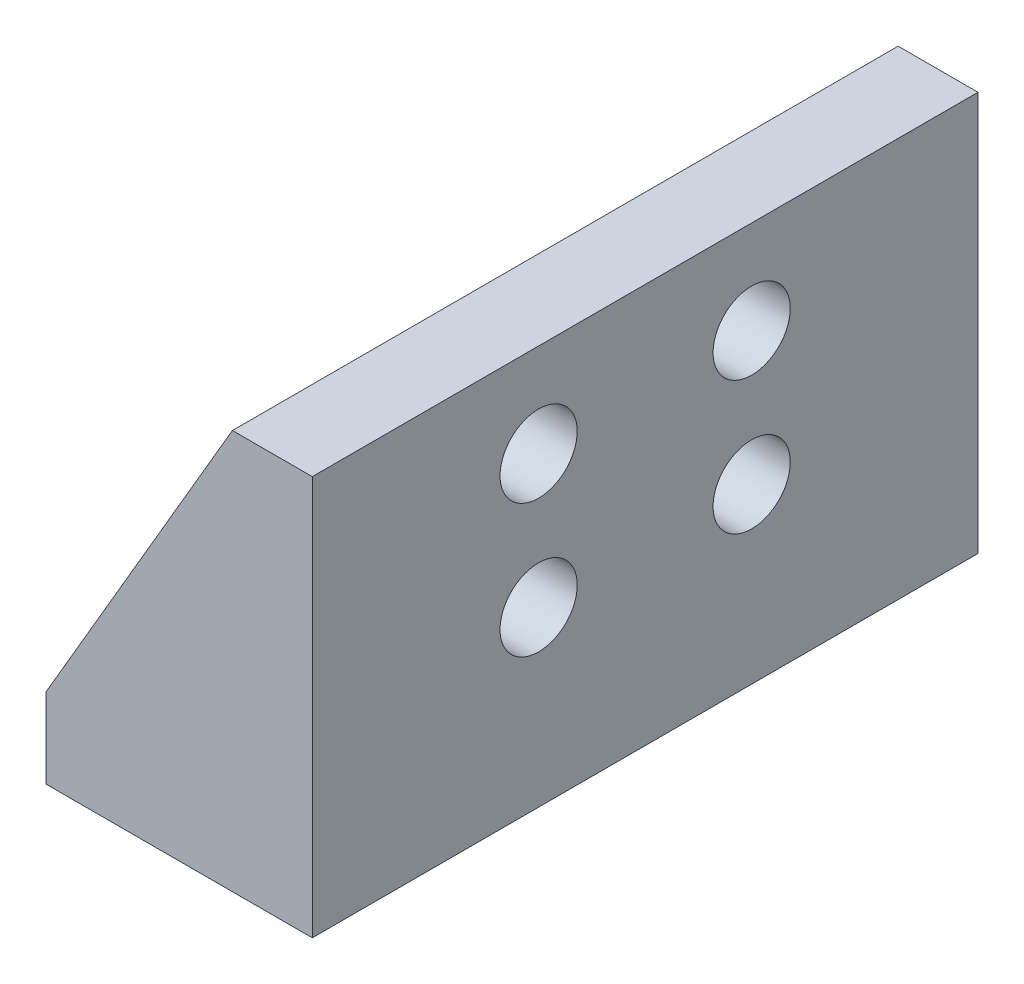
ISO-10303-21;
HEADER;
FILE_DESCRIPTION(('STEP AP214'),'2;1');
FILE_NAME('part.step','',(''),(''),'','','');
FILE_SCHEMA(('AUTOMOTIVE_DESIGN { 1 0 10303 214 1 1 1 1 }'));
ENDSEC;
DATA;
#1=APPLICATION_CONTEXT('core data for automotive mechanical design processes');
#2=APPLICATION_PROTOCOL_DEFINITION('international standard','automotive_design',2000,#1);
#3=PRODUCT_CONTEXT('',#1,'mechanical');
#4=PRODUCT('Part','Part','',(#3));
#5=PRODUCT_RELATED_PRODUCT_CATEGORY('part','',(#4));
#6=PRODUCT_DEFINITION_FORMATION('','',#4);
#7=PRODUCT_DEFINITION_CONTEXT('part definition',#1,'design');
#8=PRODUCT_DEFINITION('design','',#6,#7);
#9=PRODUCT_DEFINITION_SHAPE('','',#8);
#10=(LENGTH_UNIT() NAMED_UNIT(*) SI_UNIT(.MILLI.,.METRE.));
#11=(NAMED_UNIT(*) PLANE_ANGLE_UNIT() SI_UNIT($,.RADIAN.));
#12=(NAMED_UNIT(*) SI_UNIT($,.STERADIAN.) SOLID_ANGLE_UNIT());
#13=UNCERTAINTY_MEASURE_WITH_UNIT(LENGTH_MEASURE(1.E-05),#10,'distance_accuracy_value','');
#14=(GEOMETRIC_REPRESENTATION_CONTEXT(3) GLOBAL_UNCERTAINTY_ASSIGNED_CONTEXT((#13)) GLOBAL_UNIT_ASSIGNED_CONTEXT((#10,
#11,#12)) REPRESENTATION_CONTEXT('',''));
#15=CARTESIAN_POINT('',(0.,0.,0.));
#16=DIRECTION('',(0.,0.,1.));
#17=DIRECTION('',(1.,0.,0.));
#18=AXIS2_PLACEMENT_3D('',#15,#16,#17);
#19=CARTESIAN_POINT('',(3.5,-297.,-8.75));
#20=DIRECTION('',(0.,1.,0.));
#21=DIRECTION('',(0.,0.,1.));
#22=AXIS2_PLACEMENT_3D('',#19,#20,#21);
#23=CYLINDRICAL_SURFACE('',#22,1.45);
#24=CARTESIAN_POINT('',(3.5,0.,-8.75));
#25=DIRECTION('',(0.,-1.,0.));
#26=DIRECTION('',(0.,0.,-1.));
#27=AXIS2_PLACEMENT_3D('',#24,#25,#26);
#28=CIRCLE('',#27,1.45);
#29=CARTESIAN_POINT('',(3.5,0.,-10.2));
#30=VERTEX_POINT('',#29);
#31=EDGE_CURVE('E193',#30,#30,#28,.T.);
#32=ORIENTED_EDGE('',*,*,#31,.T.);
#33=EDGE_LOOP('',(#32));
#34=FACE_BOUND('',#33,.T.);
#35=CARTESIAN_POINT('',(3.5,1.,-8.75));
#36=DIRECTION('',(0.,1.,0.));
#37=DIRECTION('',(0.,0.,1.));
#38=AXIS2_PLACEMENT_3D('',#35,#36,#37);
#39=CIRCLE('',#38,1.45);
#40=CARTESIAN_POINT('',(3.5,1.,-7.3));
#41=VERTEX_POINT('',#40);
#42=EDGE_CURVE('E45',#41,#41,#39,.F.);
#43=ORIENTED_EDGE('',*,*,#42,.F.);
#44=EDGE_LOOP('',(#43));
#45=FACE_BOUND('',#44,.T.);
#46=ADVANCED_FACE('F41',(#34,#45),#23,.F.);
#47=CARTESIAN_POINT('',(3.5,-297.,-16.25));
#48=DIRECTION('',(0.,1.,0.));
#49=DIRECTION('',(0.,0.,1.));
#50=AXIS2_PLACEMENT_3D('',#47,#48,#49);
#51=CYLINDRICAL_SURFACE('',#50,1.45);
#52=CARTESIAN_POINT('',(3.5,0.,-16.25));
#53=DIRECTION('',(0.,-1.,0.));
#54=DIRECTION('',(0.,0.,-1.));
#55=AXIS2_PLACEMENT_3D('',#52,#53,#54);
#56=CIRCLE('',#55,1.45);
#57=CARTESIAN_POINT('',(3.5,0.,-17.7));
#58=VERTEX_POINT('',#57);
#59=EDGE_CURVE('E196',#58,#58,#56,.T.);
#60=ORIENTED_EDGE('',*,*,#59,.T.);
#61=EDGE_LOOP('',(#60));
#62=FACE_BOUND('',#61,.T.);
#63=CARTESIAN_POINT('',(3.5,1.,-16.25));
#64=DIRECTION('',(0.,1.,0.));
#65=DIRECTION('',(0.,0.,1.));
#66=AXIS2_PLACEMENT_3D('',#63,#64,#65);
#67=CIRCLE('',#66,1.45);
#68=CARTESIAN_POINT('',(3.5,1.,-14.8));
#69=VERTEX_POINT('',#68);
#70=EDGE_CURVE('E199',#69,#69,#67,.F.);
#71=ORIENTED_EDGE('',*,*,#70,.F.);
#72=EDGE_LOOP('',(#71));
#73=FACE_BOUND('',#72,.T.);
#74=ADVANCED_FACE('F243',(#62,#73),#51,.F.);
#75=CARTESIAN_POINT('',(0.,3.,-25.));
#76=DIRECTION('',(0.,1.,0.));
#77=DIRECTION('',(0.,0.,1.));
#78=AXIS2_PLACEMENT_3D('',#75,#76,#77);
#79=PLANE('',#78);
#80=CARTESIAN_POINT('',(3.5,3.,-16.25));
#81=DIRECTION('',(0.,1.,0.));
#82=DIRECTION('',(0.,0.,1.));
#83=AXIS2_PLACEMENT_3D('',#80,#81,#82);
#84=CIRCLE('',#83,2.6);
#85=CARTESIAN_POINT('',(3.5,3.,-13.65));
#86=VERTEX_POINT('',#85);
#87=EDGE_CURVE('E206',#86,#86,#84,.T.);
#88=ORIENTED_EDGE('',*,*,#87,.F.);
#89=EDGE_LOOP('',(#88));
#90=FACE_BOUND('',#89,.T.);
#91=CARTESIAN_POINT('',(3.5,3.,-8.75));
#92=DIRECTION('',(0.,1.,0.));
#93=DIRECTION('',(0.,0.,1.));
#94=AXIS2_PLACEMENT_3D('',#91,#92,#93);
#95=CIRCLE('',#94,2.6);
#96=CARTESIAN_POINT('',(3.5,3.,-6.15));
#97=VERTEX_POINT('',#96);
#98=EDGE_CURVE('E216',#97,#97,#95,.T.);
#99=ORIENTED_EDGE('',*,*,#98,.F.);
#100=EDGE_LOOP('',(#99));
#101=FACE_BOUND('',#100,.T.);
#102=DIRECTION('',(0.,0.,1.));
#103=VECTOR('',#102,1.);
#104=CARTESIAN_POINT('',(7.,3.,-25.));
#105=LINE('',#104,#103);
#106=CARTESIAN_POINT('',(7.,3.,-20.));
#107=VERTEX_POINT('',#106);
#108=CARTESIAN_POINT('',(7.,3.,-5.));
#109=VERTEX_POINT('',#108);
#110=EDGE_CURVE('E175',#107,#109,#105,.T.);
#111=ORIENTED_EDGE('',*,*,#110,.F.);
#112=DIRECTION('',(-1.,0.,0.));
#113=VECTOR('',#112,1.);
#114=CARTESIAN_POINT('',(7.,3.,-20.));
#115=LINE('',#114,#113);
#116=CARTESIAN_POINT('',(0.,3.,-20.));
#117=VERTEX_POINT('',#116);
#118=EDGE_CURVE('E58',#107,#117,#115,.T.);
#119=ORIENTED_EDGE('',*,*,#118,.T.);
#120=DIRECTION('',(0.,0.,1.));
#121=VECTOR('',#120,1.);
#122=CARTESIAN_POINT('',(0.,3.,-25.));
#123=LINE('',#122,#121);
#124=CARTESIAN_POINT('',(0.,3.,-5.));
#125=VERTEX_POINT('',#124);
#126=EDGE_CURVE('E50',#117,#125,#123,.T.);
#127=ORIENTED_EDGE('',*,*,#126,.T.);
#128=DIRECTION('',(1.,0.,0.));
#129=VECTOR('',#128,1.);
#130=CARTESIAN_POINT('',(7.,3.,-5.));
#131=LINE('',#130,#129);
#132=EDGE_CURVE('E147',#125,#109,#131,.T.);
#133=ORIENTED_EDGE('',*,*,#132,.T.);
#134=EDGE_LOOP('',(#111,#119,#127,#133));
#135=FACE_BOUND('',#134,.T.);
#136=ADVANCED_FACE('F250',(#90,#101,#135),#79,.T.);
#137=CARTESIAN_POINT('',(7.,3.,-25.));
#138=DIRECTION('',(-1.,0.,0.));
#139=DIRECTION('',(0.,0.,1.));
#140=AXIS2_PLACEMENT_3D('',#137,#138,#139);
#141=PLANE('',#140);
#142=CARTESIAN_POINT('',(7.,6.5,-16.5));
#143=DIRECTION('',(-1.,0.,0.));
#144=DIRECTION('',(0.,0.,1.));
#145=AXIS2_PLACEMENT_3D('',#142,#143,#144);
#146=CIRCLE('',#145,1.45);
#147=CARTESIAN_POINT('',(7.,6.5,-15.05));
#148=VERTEX_POINT('',#147);
#149=EDGE_CURVE('E222',#148,#148,#146,.T.);
#150=ORIENTED_EDGE('',*,*,#149,.F.);
#151=EDGE_LOOP('',(#150));
#152=FACE_BOUND('',#151,.T.);
#153=CARTESIAN_POINT('',(7.,11.5,-8.5));
#154=DIRECTION('',(-1.,0.,0.));
#155=DIRECTION('',(0.,0.,1.));
#156=AXIS2_PLACEMENT_3D('',#153,#154,#155);
#157=CIRCLE('',#156,1.45);
#158=CARTESIAN_POINT('',(7.,11.5,-7.05));
#159=VERTEX_POINT('',#158);
#160=EDGE_CURVE('E221',#159,#159,#157,.T.);
#161=ORIENTED_EDGE('',*,*,#160,.F.);
#162=EDGE_LOOP('',(#161));
#163=FACE_BOUND('',#162,.T.);
#164=CARTESIAN_POINT('',(7.,6.5,-8.5));
#165=DIRECTION('',(-1.,0.,0.));
#166=DIRECTION('',(0.,0.,1.));
#167=AXIS2_PLACEMENT_3D('',#164,#165,#166);
#168=CIRCLE('',#167,1.45);
#169=CARTESIAN_POINT('',(7.,6.5,-7.05));
#170=VERTEX_POINT('',#169);
#171=EDGE_CURVE('E198',#170,#170,#168,.T.);
#172=ORIENTED_EDGE('',*,*,#171,.F.);
#173=EDGE_LOOP('',(#172));
#174=FACE_BOUND('',#173,.T.);
#175=CARTESIAN_POINT('',(7.,11.5,-16.5));
#176=DIRECTION('',(-1.,0.,0.));
#177=DIRECTION('',(0.,0.,1.));
#178=AXIS2_PLACEMENT_3D('',#175,#176,#177);
#179=CIRCLE('',#178,1.45);
#180=CARTESIAN_POINT('',(7.,11.5,-15.05));
#181=VERTEX_POINT('',#180);
#182=EDGE_CURVE('E188',#181,#181,#179,.T.);
#183=ORIENTED_EDGE('',*,*,#182,.F.);
#184=EDGE_LOOP('',(#183));
#185=FACE_BOUND('',#184,.T.);
#186=DIRECTION('',(0.,0.,1.));
#187=VECTOR('',#186,1.);
#188=CARTESIAN_POINT('',(7.,15.,-25.));
#189=LINE('',#188,#187);
#190=CARTESIAN_POINT('',(7.,15.,-20.));
#191=VERTEX_POINT('',#190);
#192=CARTESIAN_POINT('',(7.,15.,-5.));
#193=VERTEX_POINT('',#192);
#194=EDGE_CURVE('E178',#191,#193,#189,.T.);
#195=ORIENTED_EDGE('',*,*,#194,.F.);
#196=DIRECTION('',(0.,-1.,0.));
#197=VECTOR('',#196,1.);
#198=CARTESIAN_POINT('',(7.,15.,-20.));
#199=LINE('',#198,#197);
#200=EDGE_CURVE('E66',#191,#107,#199,.T.);
#201=ORIENTED_EDGE('',*,*,#200,.T.);
#202=ORIENTED_EDGE('',*,*,#110,.T.);
#203=DIRECTION('',(0.,1.,0.));
#204=VECTOR('',#203,1.);
#205=CARTESIAN_POINT('',(7.,15.,-5.));
#206=LINE('',#205,#204);
#207=EDGE_CURVE('E140',#109,#193,#206,.T.);
#208=ORIENTED_EDGE('',*,*,#207,.T.);
#209=EDGE_LOOP('',(#195,#201,#202,#208));
#210=FACE_BOUND('',#209,.T.);
#211=ADVANCED_FACE('F273',(#152,#163,#174,#185,#210),#141,.T.);
#212=CARTESIAN_POINT('',(0.,0.,-25.));
#213=DIRECTION('',(-1.,0.,0.));
#214=DIRECTION('',(0.,0.,1.));
#215=AXIS2_PLACEMENT_3D('',#212,#213,#214);
#216=PLANE('',#215);
#217=DIRECTION('',(0.,-1.,0.));
#218=VECTOR('',#217,1.);
#219=CARTESIAN_POINT('',(0.,0.,0.));
#220=LINE('',#219,#218);
#221=CARTESIAN_POINT('',(0.,3.,0.));
#222=VERTEX_POINT('',#221);
#223=CARTESIAN_POINT('',(0.,0.,0.));
#224=VERTEX_POINT('',#223);
#225=EDGE_CURVE('E155',#222,#224,#220,.T.);
#226=ORIENTED_EDGE('',*,*,#225,.F.);
#227=DIRECTION('',(0.,0.,1.));
#228=VECTOR('',#227,1.);
#229=CARTESIAN_POINT('',(0.,3.,-5.));
#230=LINE('',#229,#228);
#231=EDGE_CURVE('E152',#125,#222,#230,.T.);
#232=ORIENTED_EDGE('',*,*,#231,.F.);
#233=ORIENTED_EDGE('',*,*,#126,.F.);
#234=CARTESIAN_POINT('',(0.,3.,-25.));
#235=VERTEX_POINT('',#234);
#236=EDGE_CURVE('E11',#235,#117,#123,.T.);
#237=ORIENTED_EDGE('',*,*,#236,.F.);
#238=DIRECTION('',(0.,-1.,0.));
#239=VECTOR('',#238,1.);
#240=CARTESIAN_POINT('',(0.,0.,-25.));
#241=LINE('',#240,#239);
#242=CARTESIAN_POINT('',(0.,0.,-25.));
#243=VERTEX_POINT('',#242);
#244=EDGE_CURVE('E109',#235,#243,#241,.T.);
#245=ORIENTED_EDGE('',*,*,#244,.T.);
#246=DIRECTION('',(0.,0.,1.));
#247=VECTOR('',#246,1.);
#248=CARTESIAN_POINT('',(0.,0.,-25.));
#249=LINE('',#248,#247);
#250=EDGE_CURVE('E164',#243,#224,#249,.T.);
#251=ORIENTED_EDGE('',*,*,#250,.T.);
#252=EDGE_LOOP('',(#226,#232,#233,#237,#245,#251));
#253=FACE_BOUND('',#252,.T.);
#254=ADVANCED_FACE('F43',(#253),#216,.T.);
#255=CARTESIAN_POINT('',(7.,15.,-25.));
#256=DIRECTION('',(0.,1.,0.));
#257=DIRECTION('',(0.,0.,1.));
#258=AXIS2_PLACEMENT_3D('',#255,#256,#257);
#259=PLANE('',#258);
#260=DIRECTION('',(-1.,0.,0.));
#261=VECTOR('',#260,1.);
#262=CARTESIAN_POINT('',(7.,15.,0.));
#263=LINE('',#262,#261);
#264=CARTESIAN_POINT('',(10.,15.,0.));
#265=VERTEX_POINT('',#264);
#266=CARTESIAN_POINT('',(7.,15.,0.));
#267=VERTEX_POINT('',#266);
#268=EDGE_CURVE('E119',#265,#267,#263,.T.);
#269=ORIENTED_EDGE('',*,*,#268,.F.);
#270=DIRECTION('',(0.,0.,1.));
#271=VECTOR('',#270,1.);
#272=CARTESIAN_POINT('',(10.,15.,-25.));
#273=LINE('',#272,#271);
#274=CARTESIAN_POINT('',(10.,15.,-25.));
#275=VERTEX_POINT('',#274);
#276=EDGE_CURVE('E179',#275,#265,#273,.T.);
#277=ORIENTED_EDGE('',*,*,#276,.F.);
#278=DIRECTION('',(-1.,0.,0.));
#279=VECTOR('',#278,1.);
#280=CARTESIAN_POINT('',(7.,15.,-25.));
#281=LINE('',#280,#279);
#282=CARTESIAN_POINT('',(7.,15.,-25.));
#283=VERTEX_POINT('',#282);
#284=EDGE_CURVE('E162',#275,#283,#281,.T.);
#285=ORIENTED_EDGE('',*,*,#284,.T.);
#286=EDGE_CURVE('E129',#283,#191,#189,.T.);
#287=ORIENTED_EDGE('',*,*,#286,.T.);
#288=ORIENTED_EDGE('',*,*,#194,.T.);
#289=DIRECTION('',(0.,0.,1.));
#290=VECTOR('',#289,1.);
#291=CARTESIAN_POINT('',(7.,15.,-5.));
#292=LINE('',#291,#290);
#293=EDGE_CURVE('E150',#193,#267,#292,.T.);
#294=ORIENTED_EDGE('',*,*,#293,.T.);
#295=EDGE_LOOP('',(#269,#277,#285,#287,#288,#294));
#296=FACE_BOUND('',#295,.T.);
#297=ADVANCED_FACE('F285',(#296),#259,.T.);
#298=CARTESIAN_POINT('',(10.,0.,-25.));
#299=DIRECTION('',(1.,0.,0.));
#300=DIRECTION('',(0.,0.,-1.));
#301=AXIS2_PLACEMENT_3D('',#298,#299,#300);
#302=PLANE('',#301);
#303=CARTESIAN_POINT('',(10.,6.5,-16.5));
#304=DIRECTION('',(1.,0.,0.));
#305=DIRECTION('',(0.,0.,-1.));
#306=AXIS2_PLACEMENT_3D('',#303,#304,#305);
#307=CIRCLE('',#306,1.45);
#308=CARTESIAN_POINT('',(10.,6.5,-17.95));
#309=VERTEX_POINT('',#308);
#310=EDGE_CURVE('E130',#309,#309,#307,.T.);
#311=ORIENTED_EDGE('',*,*,#310,.F.);
#312=EDGE_LOOP('',(#311));
#313=FACE_BOUND('',#312,.T.);
#314=CARTESIAN_POINT('',(10.,11.5,-8.5));
#315=DIRECTION('',(1.,0.,0.));
#316=DIRECTION('',(0.,0.,-1.));
#317=AXIS2_PLACEMENT_3D('',#314,#315,#316);
#318=CIRCLE('',#317,1.45);
#319=CARTESIAN_POINT('',(10.,11.5,-9.95));
#320=VERTEX_POINT('',#319);
#321=EDGE_CURVE('E134',#320,#320,#318,.T.);
#322=ORIENTED_EDGE('',*,*,#321,.F.);
#323=EDGE_LOOP('',(#322));
#324=FACE_BOUND('',#323,.T.);
#325=CARTESIAN_POINT('',(10.,6.5,-8.5));
#326=DIRECTION('',(1.,0.,0.));
#327=DIRECTION('',(0.,0.,-1.));
#328=AXIS2_PLACEMENT_3D('',#325,#326,#327);
#329=CIRCLE('',#328,1.45);
#330=CARTESIAN_POINT('',(10.,6.5,-9.95));
#331=VERTEX_POINT('',#330);
#332=EDGE_CURVE('E187',#331,#331,#329,.T.);
#333=ORIENTED_EDGE('',*,*,#332,.F.);
#334=EDGE_LOOP('',(#333));
#335=FACE_BOUND('',#334,.T.);
#336=CARTESIAN_POINT('',(10.,11.5,-16.5));
#337=DIRECTION('',(1.,0.,0.));
#338=DIRECTION('',(0.,0.,-1.));
#339=AXIS2_PLACEMENT_3D('',#336,#337,#338);
#340=CIRCLE('',#339,1.45);
#341=CARTESIAN_POINT('',(10.,11.5,-17.95));
#342=VERTEX_POINT('',#341);
#343=EDGE_CURVE('E184',#342,#342,#340,.T.);
#344=ORIENTED_EDGE('',*,*,#343,.F.);
#345=EDGE_LOOP('',(#344));
#346=FACE_BOUND('',#345,.T.);
#347=DIRECTION('',(0.,1.,0.));
#348=VECTOR('',#347,1.);
#349=CARTESIAN_POINT('',(10.,0.,0.));
#350=LINE('',#349,#348);
#351=CARTESIAN_POINT('',(10.,0.,0.));
#352=VERTEX_POINT('',#351);
#353=EDGE_CURVE('E170',#352,#265,#350,.T.);
#354=ORIENTED_EDGE('',*,*,#353,.F.);
#355=DIRECTION('',(0.,0.,1.));
#356=VECTOR('',#355,1.);
#357=CARTESIAN_POINT('',(10.,0.,-25.));
#358=LINE('',#357,#356);
#359=CARTESIAN_POINT('',(10.,0.,-25.));
#360=VERTEX_POINT('',#359);
#361=EDGE_CURVE('E181',#360,#352,#358,.T.);
#362=ORIENTED_EDGE('',*,*,#361,.F.);
#363=DIRECTION('',(0.,1.,0.));
#364=VECTOR('',#363,1.);
#365=CARTESIAN_POINT('',(10.,0.,-25.));
#366=LINE('',#365,#364);
#367=EDGE_CURVE('E159',#360,#275,#366,.T.);
#368=ORIENTED_EDGE('',*,*,#367,.T.);
#369=ORIENTED_EDGE('',*,*,#276,.T.);
#370=EDGE_LOOP('',(#354,#362,#368,#369));
#371=FACE_BOUND('',#370,.T.);
#372=ADVANCED_FACE('F288',(#313,#324,#335,#346,#371),#302,.T.);
#373=CARTESIAN_POINT('',(0.,0.,-25.));
#374=DIRECTION('',(0.,-1.,0.));
#375=DIRECTION('',(0.,0.,-1.));
#376=AXIS2_PLACEMENT_3D('',#373,#374,#375);
#377=PLANE('',#376);
#378=ORIENTED_EDGE('',*,*,#59,.F.);
#379=EDGE_LOOP('',(#378));
#380=FACE_BOUND('',#379,.T.);
#381=ORIENTED_EDGE('',*,*,#31,.F.);
#382=EDGE_LOOP('',(#381));
#383=FACE_BOUND('',#382,.T.);
#384=DIRECTION('',(1.,0.,0.));
#385=VECTOR('',#384,1.);
#386=CARTESIAN_POINT('',(0.,0.,0.));
#387=LINE('',#386,#385);
#388=EDGE_CURVE('E167',#224,#352,#387,.T.);
#389=ORIENTED_EDGE('',*,*,#388,.F.);
#390=ORIENTED_EDGE('',*,*,#250,.F.);
#391=DIRECTION('',(1.,0.,0.));
#392=VECTOR('',#391,1.);
#393=CARTESIAN_POINT('',(0.,0.,-25.));
#394=LINE('',#393,#392);
#395=EDGE_CURVE('E117',#243,#360,#394,.T.);
#396=ORIENTED_EDGE('',*,*,#395,.T.);
#397=ORIENTED_EDGE('',*,*,#361,.T.);
#398=EDGE_LOOP('',(#389,#390,#396,#397));
#399=FACE_BOUND('',#398,.T.);
#400=ADVANCED_FACE('F291',(#380,#383,#399),#377,.T.);
#401=CARTESIAN_POINT('',(0.,0.,-25.));
#402=DIRECTION('',(0.,0.,-1.));
#403=DIRECTION('',(-1.,0.,0.));
#404=AXIS2_PLACEMENT_3D('',#401,#402,#403);
#405=PLANE('',#404);
#406=ORIENTED_EDGE('',*,*,#244,.F.);
#407=DIRECTION('',(0.503871025524086,0.863778900898433,0.));
#408=VECTOR('',#407,1.);
#409=CARTESIAN_POINT('',(7.,15.,-25.));
#410=LINE('',#409,#408);
#411=EDGE_CURVE('E114',#235,#283,#410,.T.);
#412=ORIENTED_EDGE('',*,*,#411,.T.);
#413=ORIENTED_EDGE('',*,*,#284,.F.);
#414=ORIENTED_EDGE('',*,*,#367,.F.);
#415=ORIENTED_EDGE('',*,*,#395,.F.);
#416=EDGE_LOOP('',(#406,#412,#413,#414,#415));
#417=FACE_BOUND('',#416,.T.);
#418=ADVANCED_FACE('F111',(#417),#405,.T.);
#419=CARTESIAN_POINT('',(0.,0.,0.));
#420=DIRECTION('',(0.,0.,-1.));
#421=DIRECTION('',(-1.,0.,0.));
#422=AXIS2_PLACEMENT_3D('',#419,#420,#421);
#423=PLANE('',#422);
#424=ORIENTED_EDGE('',*,*,#225,.T.);
#425=ORIENTED_EDGE('',*,*,#388,.T.);
#426=ORIENTED_EDGE('',*,*,#353,.T.);
#427=ORIENTED_EDGE('',*,*,#268,.T.);
#428=DIRECTION('',(-0.503871025524086,-0.863778900898433,0.));
#429=VECTOR('',#428,1.);
#430=CARTESIAN_POINT('',(7.,15.,0.));
#431=LINE('',#430,#429);
#432=EDGE_CURVE('E144',#267,#222,#431,.T.);
#433=ORIENTED_EDGE('',*,*,#432,.T.);
#434=EDGE_LOOP('',(#424,#425,#426,#427,#433));
#435=FACE_BOUND('',#434,.T.);
#436=ADVANCED_FACE('F293',(#435),#423,.F.);
#437=CARTESIAN_POINT('',(7.,15.,-5.));
#438=DIRECTION('',(-0.863778900898433,0.503871025524086,0.));
#439=DIRECTION('',(-0.503871025524086,-0.863778900898434,0.));
#440=AXIS2_PLACEMENT_3D('',#437,#438,#439);
#441=PLANE('',#440);
#442=ORIENTED_EDGE('',*,*,#432,.F.);
#443=ORIENTED_EDGE('',*,*,#293,.F.);
#444=DIRECTION('',(-0.503871025524086,-0.863778900898433,0.));
#445=VECTOR('',#444,1.);
#446=CARTESIAN_POINT('',(7.,15.,-5.));
#447=LINE('',#446,#445);
#448=EDGE_CURVE('E143',#193,#125,#447,.T.);
#449=ORIENTED_EDGE('',*,*,#448,.T.);
#450=ORIENTED_EDGE('',*,*,#231,.T.);
#451=EDGE_LOOP('',(#442,#443,#449,#450));
#452=FACE_BOUND('',#451,.T.);
#453=ADVANCED_FACE('F295',(#452),#441,.T.);
#454=CARTESIAN_POINT('',(0.,0.,-5.));
#455=DIRECTION('',(0.,0.,-1.));
#456=DIRECTION('',(-1.,0.,0.));
#457=AXIS2_PLACEMENT_3D('',#454,#455,#456);
#458=PLANE('',#457);
#459=ORIENTED_EDGE('',*,*,#207,.F.);
#460=ORIENTED_EDGE('',*,*,#132,.F.);
#461=ORIENTED_EDGE('',*,*,#448,.F.);
#462=EDGE_LOOP('',(#459,#460,#461));
#463=FACE_BOUND('',#462,.T.);
#464=ADVANCED_FACE('F240',(#463),#458,.T.);
#465=CARTESIAN_POINT('',(7.,15.,-20.));
#466=DIRECTION('',(-0.863778900898433,0.503871025524086,0.));
#467=DIRECTION('',(-0.503871025524086,-0.863778900898434,0.));
#468=AXIS2_PLACEMENT_3D('',#465,#466,#467);
#469=PLANE('',#468);
#470=ORIENTED_EDGE('',*,*,#411,.F.);
#471=ORIENTED_EDGE('',*,*,#236,.T.);
#472=DIRECTION('',(0.503871025524086,0.863778900898433,0.));
#473=VECTOR('',#472,1.);
#474=CARTESIAN_POINT('',(7.,15.,-20.));
#475=LINE('',#474,#473);
#476=EDGE_CURVE('E138',#117,#191,#475,.T.);
#477=ORIENTED_EDGE('',*,*,#476,.T.);
#478=ORIENTED_EDGE('',*,*,#286,.F.);
#479=EDGE_LOOP('',(#470,#471,#477,#478));
#480=FACE_BOUND('',#479,.T.);
#481=ADVANCED_FACE('F127',(#480),#469,.T.);
#482=CARTESIAN_POINT('',(0.,0.,-20.));
#483=DIRECTION('',(0.,0.,-1.));
#484=DIRECTION('',(-1.,0.,0.));
#485=AXIS2_PLACEMENT_3D('',#482,#483,#484);
#486=PLANE('',#485);
#487=ORIENTED_EDGE('',*,*,#200,.F.);
#488=ORIENTED_EDGE('',*,*,#476,.F.);
#489=ORIENTED_EDGE('',*,*,#118,.F.);
#490=EDGE_LOOP('',(#487,#488,#489));
#491=FACE_BOUND('',#490,.T.);
#492=ADVANCED_FACE('F229',(#491),#486,.F.);
#493=CARTESIAN_POINT('',(307.,11.5,-16.5));
#494=DIRECTION('',(-1.,0.,0.));
#495=DIRECTION('',(0.,0.,1.));
#496=AXIS2_PLACEMENT_3D('',#493,#494,#495);
#497=CYLINDRICAL_SURFACE('',#496,1.45);
#498=ORIENTED_EDGE('',*,*,#343,.T.);
#499=EDGE_LOOP('',(#498));
#500=FACE_BOUND('',#499,.T.);
#501=ORIENTED_EDGE('',*,*,#182,.T.);
#502=EDGE_LOOP('',(#501));
#503=FACE_BOUND('',#502,.T.);
#504=ADVANCED_FACE('F231',(#500,#503),#497,.F.);
#505=CARTESIAN_POINT('',(307.,6.5,-8.5));
#506=DIRECTION('',(-1.,0.,0.));
#507=DIRECTION('',(0.,0.,1.));
#508=AXIS2_PLACEMENT_3D('',#505,#506,#507);
#509=CYLINDRICAL_SURFACE('',#508,1.45);
#510=ORIENTED_EDGE('',*,*,#332,.T.);
#511=EDGE_LOOP('',(#510));
#512=FACE_BOUND('',#511,.T.);
#513=ORIENTED_EDGE('',*,*,#171,.T.);
#514=EDGE_LOOP('',(#513));
#515=FACE_BOUND('',#514,.T.);
#516=ADVANCED_FACE('F237',(#512,#515),#509,.F.);
#517=CARTESIAN_POINT('',(307.,11.5,-8.5));
#518=DIRECTION('',(-1.,0.,0.));
#519=DIRECTION('',(0.,0.,1.));
#520=AXIS2_PLACEMENT_3D('',#517,#518,#519);
#521=CYLINDRICAL_SURFACE('',#520,1.45);
#522=ORIENTED_EDGE('',*,*,#321,.T.);
#523=EDGE_LOOP('',(#522));
#524=FACE_BOUND('',#523,.T.);
#525=ORIENTED_EDGE('',*,*,#160,.T.);
#526=EDGE_LOOP('',(#525));
#527=FACE_BOUND('',#526,.T.);
#528=ADVANCED_FACE('F258',(#524,#527),#521,.F.);
#529=CARTESIAN_POINT('',(307.,6.5,-16.5));
#530=DIRECTION('',(-1.,0.,0.));
#531=DIRECTION('',(0.,0.,1.));
#532=AXIS2_PLACEMENT_3D('',#529,#530,#531);
#533=CYLINDRICAL_SURFACE('',#532,1.45);
#534=ORIENTED_EDGE('',*,*,#310,.T.);
#535=EDGE_LOOP('',(#534));
#536=FACE_BOUND('',#535,.T.);
#537=ORIENTED_EDGE('',*,*,#149,.T.);
#538=EDGE_LOOP('',(#537));
#539=FACE_BOUND('',#538,.T.);
#540=ADVANCED_FACE('F260',(#536,#539),#533,.F.);
#541=CARTESIAN_POINT('',(3.5,1.,-16.25));
#542=DIRECTION('',(0.,1.,0.));
#543=DIRECTION('',(0.,0.,1.));
#544=AXIS2_PLACEMENT_3D('',#541,#542,#543);
#545=PLANE('',#544);
#546=CARTESIAN_POINT('',(3.5,1.,-16.25));
#547=DIRECTION('',(0.,1.,0.));
#548=DIRECTION('',(0.,0.,1.));
#549=AXIS2_PLACEMENT_3D('',#546,#547,#548);
#550=CIRCLE('',#549,2.6);
#551=CARTESIAN_POINT('',(3.5,1.,-13.65));
#552=VERTEX_POINT('',#551);
#553=EDGE_CURVE('E201',#552,#552,#550,.T.);
#554=ORIENTED_EDGE('',*,*,#553,.T.);
#555=EDGE_LOOP('',(#554));
#556=FACE_BOUND('',#555,.T.);
#557=ORIENTED_EDGE('',*,*,#70,.T.);
#558=EDGE_LOOP('',(#557));
#559=FACE_BOUND('',#558,.T.);
#560=ADVANCED_FACE('F263',(#556,#559),#545,.T.);
#561=CARTESIAN_POINT('',(3.5,1.,-16.25));
#562=DIRECTION('',(0.,1.,0.));
#563=DIRECTION('',(0.,0.,1.));
#564=AXIS2_PLACEMENT_3D('',#561,#562,#563);
#565=CYLINDRICAL_SURFACE('',#564,2.6);
#566=ORIENTED_EDGE('',*,*,#553,.F.);
#567=EDGE_LOOP('',(#566));
#568=FACE_BOUND('',#567,.T.);
#569=ORIENTED_EDGE('',*,*,#87,.T.);
#570=EDGE_LOOP('',(#569));
#571=FACE_BOUND('',#570,.T.);
#572=ADVANCED_FACE('F400',(#568,#571),#565,.F.);
#573=CARTESIAN_POINT('',(3.5,1.,-8.75));
#574=DIRECTION('',(0.,1.,0.));
#575=DIRECTION('',(0.,0.,1.));
#576=AXIS2_PLACEMENT_3D('',#573,#574,#575);
#577=PLANE('',#576);
#578=CARTESIAN_POINT('',(3.5,1.,-8.75));
#579=DIRECTION('',(0.,1.,0.));
#580=DIRECTION('',(0.,0.,1.));
#581=AXIS2_PLACEMENT_3D('',#578,#579,#580);
#582=CIRCLE('',#581,2.6);
#583=CARTESIAN_POINT('',(3.5,1.,-6.15));
#584=VERTEX_POINT('',#583);
#585=EDGE_CURVE('E211',#584,#584,#582,.T.);
#586=ORIENTED_EDGE('',*,*,#585,.T.);
#587=EDGE_LOOP('',(#586));
#588=FACE_BOUND('',#587,.T.);
#589=ORIENTED_EDGE('',*,*,#42,.T.);
#590=EDGE_LOOP('',(#589));
#591=FACE_BOUND('',#590,.T.);
#592=ADVANCED_FACE('F406',(#588,#591),#577,.T.);
#593=CARTESIAN_POINT('',(3.5,1.,-8.75));
#594=DIRECTION('',(0.,1.,0.));
#595=DIRECTION('',(0.,0.,1.));
#596=AXIS2_PLACEMENT_3D('',#593,#594,#595);
#597=CYLINDRICAL_SURFACE('',#596,2.6);
#598=ORIENTED_EDGE('',*,*,#585,.F.);
#599=EDGE_LOOP('',(#598));
#600=FACE_BOUND('',#599,.T.);
#601=ORIENTED_EDGE('',*,*,#98,.T.);
#602=EDGE_LOOP('',(#601));
#603=FACE_BOUND('',#602,.T.);
#604=ADVANCED_FACE('F414',(#600,#603),#597,.F.);
#605=CLOSED_SHELL('',(#46,#74,#136,#211,#254,#297,#372,#400,#418,#436,#453,#464,#481,#492,#504,
#516,#528,#540,#560,#572,#592,#604));
#606=MANIFOLD_SOLID_BREP('B2',#605);
#607=ADVANCED_BREP_SHAPE_REPRESENTATION('',(#18,#606),#14);
#608=SHAPE_DEFINITION_REPRESENTATION(#9,#607);
ENDSEC;
END-ISO-10303-21;
